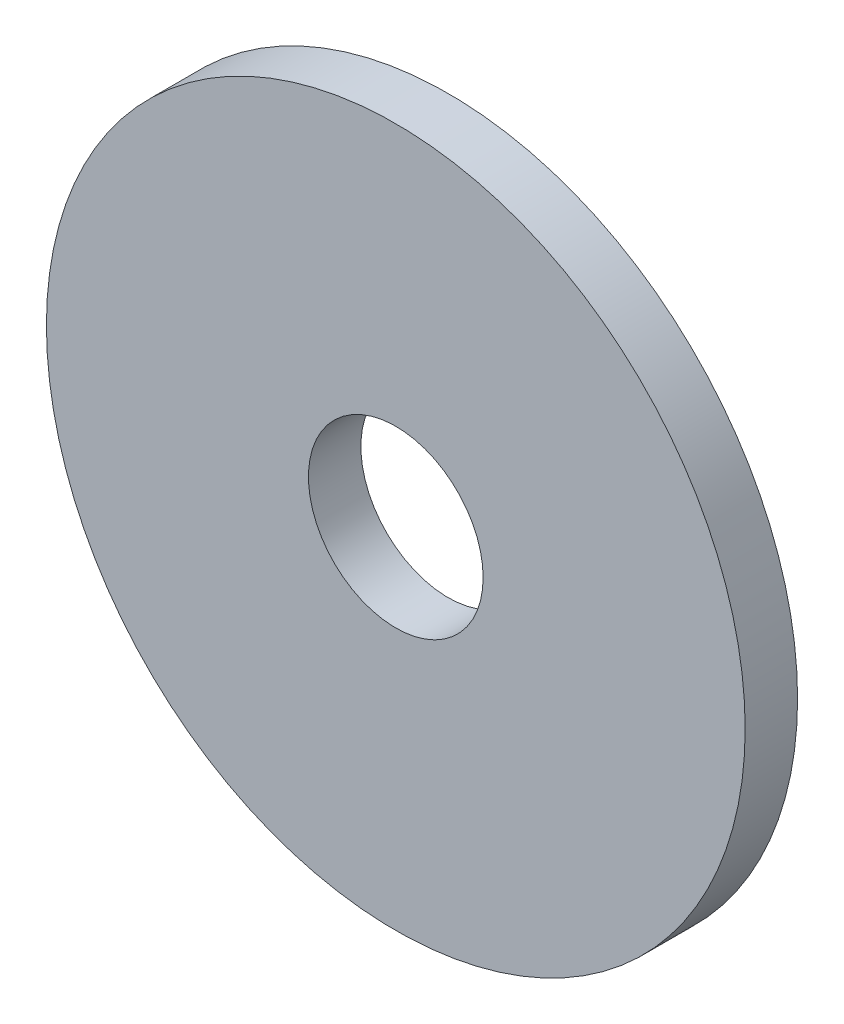
ISO-10303-21;
HEADER;
FILE_DESCRIPTION(('STEP AP214'),'2;1');
FILE_NAME('part.step','',(''),(''),'','','');
FILE_SCHEMA(('AUTOMOTIVE_DESIGN { 1 0 10303 214 1 1 1 1 }'));
ENDSEC;
DATA;
#1=APPLICATION_CONTEXT('core data for automotive mechanical design processes');
#2=APPLICATION_PROTOCOL_DEFINITION('international standard','automotive_design',2000,#1);
#3=PRODUCT_CONTEXT('',#1,'mechanical');
#4=PRODUCT('Part','Part','',(#3));
#5=PRODUCT_RELATED_PRODUCT_CATEGORY('part','',(#4));
#6=PRODUCT_DEFINITION_FORMATION('','',#4);
#7=PRODUCT_DEFINITION_CONTEXT('part definition',#1,'design');
#8=PRODUCT_DEFINITION('design','',#6,#7);
#9=PRODUCT_DEFINITION_SHAPE('','',#8);
#10=(LENGTH_UNIT() NAMED_UNIT(*) SI_UNIT(.MILLI.,.METRE.));
#11=(NAMED_UNIT(*) PLANE_ANGLE_UNIT() SI_UNIT($,.RADIAN.));
#12=(NAMED_UNIT(*) SI_UNIT($,.STERADIAN.) SOLID_ANGLE_UNIT());
#13=UNCERTAINTY_MEASURE_WITH_UNIT(LENGTH_MEASURE(1.E-05),#10,'distance_accuracy_value','');
#14=(GEOMETRIC_REPRESENTATION_CONTEXT(3) GLOBAL_UNCERTAINTY_ASSIGNED_CONTEXT((#13)) GLOBAL_UNIT_ASSIGNED_CONTEXT((#10,
#11,#12)) REPRESENTATION_CONTEXT('',''));
#15=CARTESIAN_POINT('',(0.,0.,0.));
#16=DIRECTION('',(0.,0.,1.));
#17=DIRECTION('',(1.,0.,0.));
#18=AXIS2_PLACEMENT_3D('',#15,#16,#17);
#19=CARTESIAN_POINT('',(45.0000000000001,-11.5000000000008,-2.99999999999991));
#20=DIRECTION('',(0.,0.,1.));
#21=DIRECTION('',(1.,0.,0.));
#22=AXIS2_PLACEMENT_3D('',#19,#20,#21);
#23=CYLINDRICAL_SURFACE('',#22,20.);
#24=CARTESIAN_POINT('',(45.0000000000001,-11.5000000000008,-2.99999999999991));
#25=DIRECTION('',(0.,0.,1.));
#26=DIRECTION('',(1.,0.,0.));
#27=AXIS2_PLACEMENT_3D('',#24,#25,#26);
#28=CIRCLE('',#27,20.);
#29=CARTESIAN_POINT('',(65.0000000000001,-11.5000000000008,-2.99999999999991));
#30=VERTEX_POINT('',#29);
#31=EDGE_CURVE('E10',#30,#30,#28,.T.);
#32=ORIENTED_EDGE('',*,*,#31,.T.);
#33=EDGE_LOOP('',(#32));
#34=FACE_BOUND('',#33,.T.);
#35=CARTESIAN_POINT('',(45.0000000000001,-11.5000000000008,0.));
#36=DIRECTION('',(0.,0.,1.));
#37=DIRECTION('',(1.,0.,0.));
#38=AXIS2_PLACEMENT_3D('',#35,#36,#37);
#39=CIRCLE('',#38,20.);
#40=CARTESIAN_POINT('',(65.0000000000001,-11.5000000000008,0.));
#41=VERTEX_POINT('',#40);
#42=EDGE_CURVE('E34',#41,#41,#39,.T.);
#43=ORIENTED_EDGE('',*,*,#42,.F.);
#44=EDGE_LOOP('',(#43));
#45=FACE_BOUND('',#44,.T.);
#46=ADVANCED_FACE('F31',(#34,#45),#23,.T.);
#47=CARTESIAN_POINT('',(45.0000000000001,-11.5000000000008,-2.99999999999991));
#48=DIRECTION('',(0.,0.,1.));
#49=DIRECTION('',(1.,0.,0.));
#50=AXIS2_PLACEMENT_3D('',#47,#48,#49);
#51=PLANE('',#50);
#52=CARTESIAN_POINT('',(45.0000000000001,-11.5000000000008,-2.99999999999991));
#53=DIRECTION('',(0.,0.,1.));
#54=DIRECTION('',(1.,0.,0.));
#55=AXIS2_PLACEMENT_3D('',#52,#53,#54);
#56=CIRCLE('',#55,4.99999999999995);
#57=CARTESIAN_POINT('',(50.0000000000001,-11.5000000000008,-2.99999999999991));
#58=VERTEX_POINT('',#57);
#59=EDGE_CURVE('E41',#58,#58,#56,.T.);
#60=ORIENTED_EDGE('',*,*,#59,.T.);
#61=EDGE_LOOP('',(#60));
#62=FACE_BOUND('',#61,.T.);
#63=ORIENTED_EDGE('',*,*,#31,.F.);
#64=EDGE_LOOP('',(#63));
#65=FACE_BOUND('',#64,.T.);
#66=ADVANCED_FACE('F49',(#62,#65),#51,.F.);
#67=CARTESIAN_POINT('',(45.0000000000001,-11.5000000000008,0.));
#68=DIRECTION('',(0.,0.,1.));
#69=DIRECTION('',(1.,0.,0.));
#70=AXIS2_PLACEMENT_3D('',#67,#68,#69);
#71=PLANE('',#70);
#72=CARTESIAN_POINT('',(45.0000000000001,-11.5000000000008,0.));
#73=DIRECTION('',(0.,0.,1.));
#74=DIRECTION('',(1.,0.,0.));
#75=AXIS2_PLACEMENT_3D('',#72,#73,#74);
#76=CIRCLE('',#75,4.99999999999995);
#77=CARTESIAN_POINT('',(50.0000000000001,-11.5000000000008,0.));
#78=VERTEX_POINT('',#77);
#79=EDGE_CURVE('E43',#78,#78,#76,.T.);
#80=ORIENTED_EDGE('',*,*,#79,.F.);
#81=EDGE_LOOP('',(#80));
#82=FACE_BOUND('',#81,.T.);
#83=ORIENTED_EDGE('',*,*,#42,.T.);
#84=EDGE_LOOP('',(#83));
#85=FACE_BOUND('',#84,.T.);
#86=ADVANCED_FACE('F55',(#82,#85),#71,.T.);
#87=CARTESIAN_POINT('',(45.0000000000001,-11.5000000000008,-2.99999999999991));
#88=DIRECTION('',(0.,0.,1.));
#89=DIRECTION('',(1.,0.,0.));
#90=AXIS2_PLACEMENT_3D('',#87,#88,#89);
#91=CYLINDRICAL_SURFACE('',#90,4.99999999999995);
#92=ORIENTED_EDGE('',*,*,#59,.F.);
#93=EDGE_LOOP('',(#92));
#94=FACE_BOUND('',#93,.T.);
#95=ORIENTED_EDGE('',*,*,#79,.T.);
#96=EDGE_LOOP('',(#95));
#97=FACE_BOUND('',#96,.T.);
#98=ADVANCED_FACE('F52',(#94,#97),#91,.F.);
#99=CLOSED_SHELL('',(#46,#66,#86,#98));
#100=MANIFOLD_SOLID_BREP('B2',#99);
#101=ADVANCED_BREP_SHAPE_REPRESENTATION('',(#18,#100),#14);
#102=SHAPE_DEFINITION_REPRESENTATION(#9,#101);
ENDSEC;
END-ISO-10303-21;
